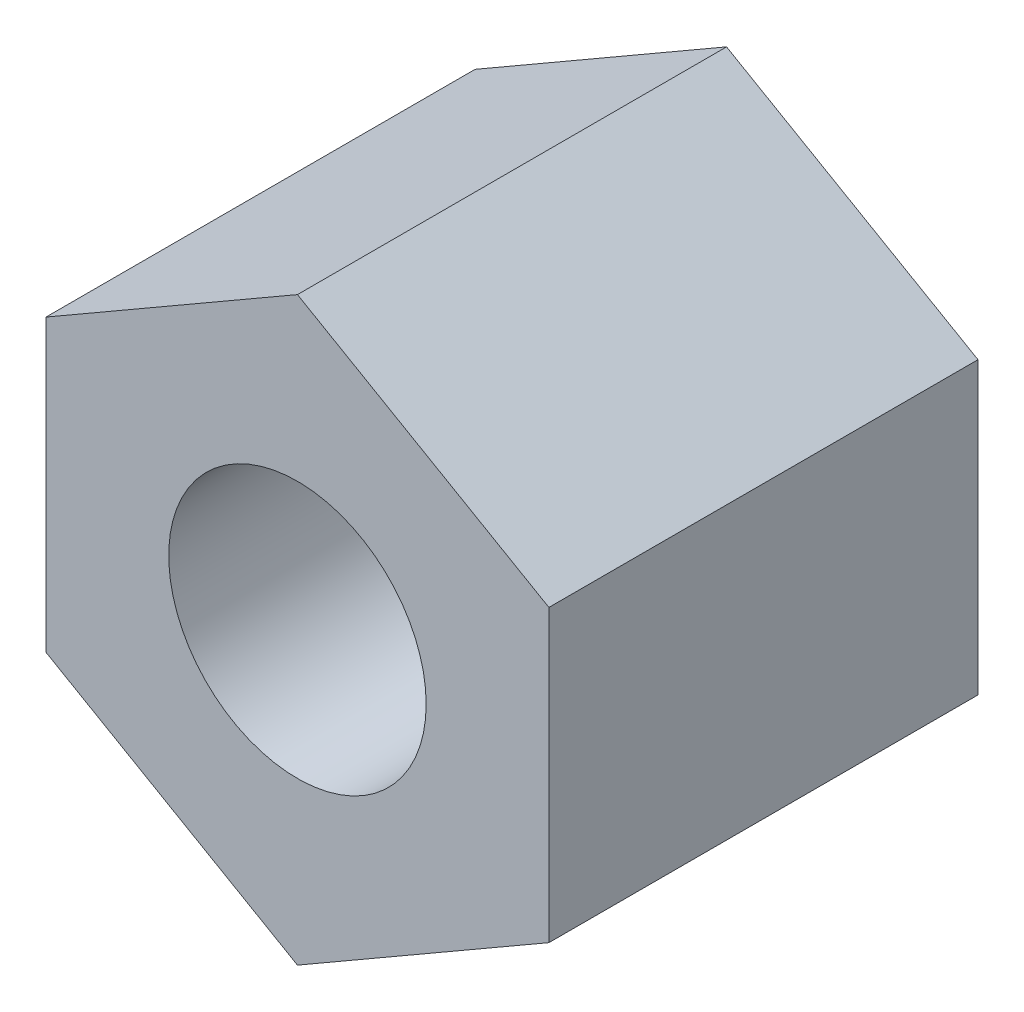
ISO-10303-21;
HEADER;
FILE_DESCRIPTION(('STEP AP214'),'2;1');
FILE_NAME('part.step','',(''),(''),'','','');
FILE_SCHEMA(('AUTOMOTIVE_DESIGN { 1 0 10303 214 1 1 1 1 }'));
ENDSEC;
DATA;
#1=APPLICATION_CONTEXT('core data for automotive mechanical design processes');
#2=APPLICATION_PROTOCOL_DEFINITION('international standard','automotive_design',2000,#1);
#3=PRODUCT_CONTEXT('',#1,'mechanical');
#4=PRODUCT('Part','Part','',(#3));
#5=PRODUCT_RELATED_PRODUCT_CATEGORY('part','',(#4));
#6=PRODUCT_DEFINITION_FORMATION('','',#4);
#7=PRODUCT_DEFINITION_CONTEXT('part definition',#1,'design');
#8=PRODUCT_DEFINITION('design','',#6,#7);
#9=PRODUCT_DEFINITION_SHAPE('','',#8);
#10=(LENGTH_UNIT() NAMED_UNIT(*) SI_UNIT(.MILLI.,.METRE.));
#11=(NAMED_UNIT(*) PLANE_ANGLE_UNIT() SI_UNIT($,.RADIAN.));
#12=(NAMED_UNIT(*) SI_UNIT($,.STERADIAN.) SOLID_ANGLE_UNIT());
#13=UNCERTAINTY_MEASURE_WITH_UNIT(LENGTH_MEASURE(1.E-05),#10,'distance_accuracy_value','');
#14=(GEOMETRIC_REPRESENTATION_CONTEXT(3) GLOBAL_UNCERTAINTY_ASSIGNED_CONTEXT((#13)) GLOBAL_UNIT_ASSIGNED_CONTEXT((#10,
#11,#12)) REPRESENTATION_CONTEXT('',''));
#15=CARTESIAN_POINT('',(0.,0.,0.));
#16=DIRECTION('',(0.,0.,1.));
#17=DIRECTION('',(1.,0.,0.));
#18=AXIS2_PLACEMENT_3D('',#15,#16,#17);
#19=CARTESIAN_POINT('',(0.,0.,5.));
#20=DIRECTION('',(0.,0.,1.));
#21=DIRECTION('',(1.,0.,0.));
#22=AXIS2_PLACEMENT_3D('',#19,#20,#21);
#23=PLANE('',#22);
#24=DIRECTION('',(0.866025403784439,-0.5,0.));
#25=VECTOR('',#24,1.);
#26=CARTESIAN_POINT('',(-2.93,-1.6916362887256,5.));
#27=LINE('',#26,#25);
#28=CARTESIAN_POINT('',(-2.93,-1.6916362887256,5.));
#29=VERTEX_POINT('',#28);
#30=CARTESIAN_POINT('',(0.,-3.38327257745121,5.));
#31=VERTEX_POINT('',#30);
#32=EDGE_CURVE('E129',#29,#31,#27,.T.);
#33=ORIENTED_EDGE('',*,*,#32,.T.);
#34=DIRECTION('',(0.866025403784439,0.5,0.));
#35=VECTOR('',#34,1.);
#36=CARTESIAN_POINT('',(0.,-3.38327257745121,5.));
#37=LINE('',#36,#35);
#38=CARTESIAN_POINT('',(2.93,-1.6916362887256,5.));
#39=VERTEX_POINT('',#38);
#40=EDGE_CURVE('E87',#31,#39,#37,.T.);
#41=ORIENTED_EDGE('',*,*,#40,.T.);
#42=DIRECTION('',(0.,1.,0.));
#43=VECTOR('',#42,1.);
#44=CARTESIAN_POINT('',(2.93,-1.6916362887256,5.));
#45=LINE('',#44,#43);
#46=CARTESIAN_POINT('',(2.93,1.69163628872561,5.));
#47=VERTEX_POINT('',#46);
#48=EDGE_CURVE('E100',#39,#47,#45,.T.);
#49=ORIENTED_EDGE('',*,*,#48,.T.);
#50=DIRECTION('',(-0.866025403784439,0.5,0.));
#51=VECTOR('',#50,1.);
#52=CARTESIAN_POINT('',(2.93,1.69163628872561,5.));
#53=LINE('',#52,#51);
#54=CARTESIAN_POINT('',(0.,3.38327257745121,5.));
#55=VERTEX_POINT('',#54);
#56=EDGE_CURVE('E94',#47,#55,#53,.T.);
#57=ORIENTED_EDGE('',*,*,#56,.T.);
#58=DIRECTION('',(-0.866025403784439,-0.5,0.));
#59=VECTOR('',#58,1.);
#60=CARTESIAN_POINT('',(0.,3.38327257745121,5.));
#61=LINE('',#60,#59);
#62=CARTESIAN_POINT('',(-2.93,1.6916362887256,5.));
#63=VERTEX_POINT('',#62);
#64=EDGE_CURVE('E98',#55,#63,#61,.T.);
#65=ORIENTED_EDGE('',*,*,#64,.T.);
#66=DIRECTION('',(0.,-1.,0.));
#67=VECTOR('',#66,1.);
#68=CARTESIAN_POINT('',(-2.93,1.6916362887256,5.));
#69=LINE('',#68,#67);
#70=EDGE_CURVE('E50',#63,#29,#69,.T.);
#71=ORIENTED_EDGE('',*,*,#70,.T.);
#72=EDGE_LOOP('',(#33,#41,#49,#57,#65,#71));
#73=FACE_BOUND('',#72,.T.);
#74=CARTESIAN_POINT('',(0.,0.,5.));
#75=DIRECTION('',(0.,0.,1.));
#76=DIRECTION('',(1.,0.,0.));
#77=AXIS2_PLACEMENT_3D('',#74,#75,#76);
#78=CIRCLE('',#77,1.5);
#79=CARTESIAN_POINT('',(1.5,0.,5.));
#80=VERTEX_POINT('',#79);
#81=EDGE_CURVE('E122',#80,#80,#78,.T.);
#82=ORIENTED_EDGE('',*,*,#81,.F.);
#83=EDGE_LOOP('',(#82));
#84=FACE_BOUND('',#83,.T.);
#85=ADVANCED_FACE('F33',(#73,#84),#23,.T.);
#86=CARTESIAN_POINT('',(0.,0.,0.));
#87=DIRECTION('',(0.,0.,1.));
#88=DIRECTION('',(1.,0.,0.));
#89=AXIS2_PLACEMENT_3D('',#86,#87,#88);
#90=PLANE('',#89);
#91=DIRECTION('',(0.866025403784439,-0.5,0.));
#92=VECTOR('',#91,1.);
#93=CARTESIAN_POINT('',(-2.93,-1.6916362887256,0.));
#94=LINE('',#93,#92);
#95=CARTESIAN_POINT('',(-2.93,-1.6916362887256,0.));
#96=VERTEX_POINT('',#95);
#97=CARTESIAN_POINT('',(0.,-3.38327257745121,0.));
#98=VERTEX_POINT('',#97);
#99=EDGE_CURVE('E118',#96,#98,#94,.T.);
#100=ORIENTED_EDGE('',*,*,#99,.F.);
#101=DIRECTION('',(0.,-1.,0.));
#102=VECTOR('',#101,1.);
#103=CARTESIAN_POINT('',(-2.93,1.6916362887256,0.));
#104=LINE('',#103,#102);
#105=CARTESIAN_POINT('',(-2.93,1.6916362887256,0.));
#106=VERTEX_POINT('',#105);
#107=EDGE_CURVE('E79',#106,#96,#104,.T.);
#108=ORIENTED_EDGE('',*,*,#107,.F.);
#109=DIRECTION('',(-0.866025403784439,-0.5,0.));
#110=VECTOR('',#109,1.);
#111=CARTESIAN_POINT('',(0.,3.38327257745121,0.));
#112=LINE('',#111,#110);
#113=CARTESIAN_POINT('',(0.,3.38327257745121,0.));
#114=VERTEX_POINT('',#113);
#115=EDGE_CURVE('E73',#114,#106,#112,.T.);
#116=ORIENTED_EDGE('',*,*,#115,.F.);
#117=DIRECTION('',(-0.866025403784439,0.5,0.));
#118=VECTOR('',#117,1.);
#119=CARTESIAN_POINT('',(2.93,1.69163628872561,0.));
#120=LINE('',#119,#118);
#121=CARTESIAN_POINT('',(2.93,1.69163628872561,0.));
#122=VERTEX_POINT('',#121);
#123=EDGE_CURVE('E108',#122,#114,#120,.T.);
#124=ORIENTED_EDGE('',*,*,#123,.F.);
#125=DIRECTION('',(0.,1.,0.));
#126=VECTOR('',#125,1.);
#127=CARTESIAN_POINT('',(2.93,-1.6916362887256,0.));
#128=LINE('',#127,#126);
#129=CARTESIAN_POINT('',(2.93,-1.6916362887256,0.));
#130=VERTEX_POINT('',#129);
#131=EDGE_CURVE('E124',#130,#122,#128,.T.);
#132=ORIENTED_EDGE('',*,*,#131,.F.);
#133=DIRECTION('',(0.866025403784439,0.5,0.));
#134=VECTOR('',#133,1.);
#135=CARTESIAN_POINT('',(0.,-3.38327257745121,0.));
#136=LINE('',#135,#134);
#137=EDGE_CURVE('E121',#98,#130,#136,.T.);
#138=ORIENTED_EDGE('',*,*,#137,.F.);
#139=EDGE_LOOP('',(#100,#108,#116,#124,#132,#138));
#140=FACE_BOUND('',#139,.T.);
#141=CARTESIAN_POINT('',(0.,0.,0.));
#142=DIRECTION('',(0.,0.,1.));
#143=DIRECTION('',(1.,0.,0.));
#144=AXIS2_PLACEMENT_3D('',#141,#142,#143);
#145=CIRCLE('',#144,1.5);
#146=CARTESIAN_POINT('',(1.5,0.,0.));
#147=VERTEX_POINT('',#146);
#148=EDGE_CURVE('E222',#147,#147,#145,.T.);
#149=ORIENTED_EDGE('',*,*,#148,.T.);
#150=EDGE_LOOP('',(#149));
#151=FACE_BOUND('',#150,.T.);
#152=ADVANCED_FACE('F138',(#140,#151),#90,.F.);
#153=CARTESIAN_POINT('',(-2.93,-1.6916362887256,5.));
#154=DIRECTION('',(0.5,0.866025403784438,0.));
#155=DIRECTION('',(-0.866025403784439,0.5,0.));
#156=AXIS2_PLACEMENT_3D('',#153,#154,#155);
#157=PLANE('',#156);
#158=ORIENTED_EDGE('',*,*,#99,.T.);
#159=DIRECTION('',(0.,0.,-1.));
#160=VECTOR('',#159,1.);
#161=CARTESIAN_POINT('',(0.,-3.38327257745121,5.));
#162=LINE('',#161,#160);
#163=EDGE_CURVE('E11',#31,#98,#162,.T.);
#164=ORIENTED_EDGE('',*,*,#163,.F.);
#165=ORIENTED_EDGE('',*,*,#32,.F.);
#166=DIRECTION('',(0.,0.,-1.));
#167=VECTOR('',#166,1.);
#168=CARTESIAN_POINT('',(-2.93,-1.6916362887256,5.));
#169=LINE('',#168,#167);
#170=EDGE_CURVE('E114',#29,#96,#169,.T.);
#171=ORIENTED_EDGE('',*,*,#170,.T.);
#172=EDGE_LOOP('',(#158,#164,#165,#171));
#173=FACE_BOUND('',#172,.T.);
#174=ADVANCED_FACE('F35',(#173),#157,.F.);
#175=CARTESIAN_POINT('',(0.,-3.38327257745121,5.));
#176=DIRECTION('',(-0.5,0.866025403784438,0.));
#177=DIRECTION('',(-0.866025403784438,-0.5,0.));
#178=AXIS2_PLACEMENT_3D('',#175,#176,#177);
#179=PLANE('',#178);
#180=ORIENTED_EDGE('',*,*,#137,.T.);
#181=DIRECTION('',(0.,0.,-1.));
#182=VECTOR('',#181,1.);
#183=CARTESIAN_POINT('',(2.93,-1.6916362887256,5.));
#184=LINE('',#183,#182);
#185=EDGE_CURVE('E42',#39,#130,#184,.T.);
#186=ORIENTED_EDGE('',*,*,#185,.F.);
#187=ORIENTED_EDGE('',*,*,#40,.F.);
#188=ORIENTED_EDGE('',*,*,#163,.T.);
#189=EDGE_LOOP('',(#180,#186,#187,#188));
#190=FACE_BOUND('',#189,.T.);
#191=ADVANCED_FACE('F163',(#190),#179,.F.);
#192=CARTESIAN_POINT('',(2.93,-1.6916362887256,5.));
#193=DIRECTION('',(-1.,0.,0.));
#194=DIRECTION('',(0.,0.,1.));
#195=AXIS2_PLACEMENT_3D('',#192,#193,#194);
#196=PLANE('',#195);
#197=ORIENTED_EDGE('',*,*,#131,.T.);
#198=DIRECTION('',(0.,0.,-1.));
#199=VECTOR('',#198,1.);
#200=CARTESIAN_POINT('',(2.93,1.69163628872561,5.));
#201=LINE('',#200,#199);
#202=EDGE_CURVE('E109',#47,#122,#201,.T.);
#203=ORIENTED_EDGE('',*,*,#202,.F.);
#204=ORIENTED_EDGE('',*,*,#48,.F.);
#205=ORIENTED_EDGE('',*,*,#185,.T.);
#206=EDGE_LOOP('',(#197,#203,#204,#205));
#207=FACE_BOUND('',#206,.T.);
#208=ADVANCED_FACE('F135',(#207),#196,.F.);
#209=CARTESIAN_POINT('',(2.93,1.69163628872561,5.));
#210=DIRECTION('',(-0.5,-0.866025403784439,0.));
#211=DIRECTION('',(0.866025403784439,-0.5,0.));
#212=AXIS2_PLACEMENT_3D('',#209,#210,#211);
#213=PLANE('',#212);
#214=ORIENTED_EDGE('',*,*,#123,.T.);
#215=DIRECTION('',(0.,0.,-1.));
#216=VECTOR('',#215,1.);
#217=CARTESIAN_POINT('',(0.,3.38327257745121,5.));
#218=LINE('',#217,#216);
#219=EDGE_CURVE('E105',#55,#114,#218,.T.);
#220=ORIENTED_EDGE('',*,*,#219,.F.);
#221=ORIENTED_EDGE('',*,*,#56,.F.);
#222=ORIENTED_EDGE('',*,*,#202,.T.);
#223=EDGE_LOOP('',(#214,#220,#221,#222));
#224=FACE_BOUND('',#223,.T.);
#225=ADVANCED_FACE('F106',(#224),#213,.F.);
#226=CARTESIAN_POINT('',(0.,3.38327257745121,5.));
#227=DIRECTION('',(0.5,-0.866025403784439,0.));
#228=DIRECTION('',(0.866025403784439,0.5,0.));
#229=AXIS2_PLACEMENT_3D('',#226,#227,#228);
#230=PLANE('',#229);
#231=ORIENTED_EDGE('',*,*,#115,.T.);
#232=DIRECTION('',(0.,0.,-1.));
#233=VECTOR('',#232,1.);
#234=CARTESIAN_POINT('',(-2.93,1.6916362887256,5.));
#235=LINE('',#234,#233);
#236=EDGE_CURVE('E110',#63,#106,#235,.T.);
#237=ORIENTED_EDGE('',*,*,#236,.F.);
#238=ORIENTED_EDGE('',*,*,#64,.F.);
#239=ORIENTED_EDGE('',*,*,#219,.T.);
#240=EDGE_LOOP('',(#231,#237,#238,#239));
#241=FACE_BOUND('',#240,.T.);
#242=ADVANCED_FACE('F112',(#241),#230,.F.);
#243=CARTESIAN_POINT('',(-2.93,1.6916362887256,5.));
#244=DIRECTION('',(1.,0.,0.));
#245=DIRECTION('',(0.,0.,-1.));
#246=AXIS2_PLACEMENT_3D('',#243,#244,#245);
#247=PLANE('',#246);
#248=ORIENTED_EDGE('',*,*,#107,.T.);
#249=ORIENTED_EDGE('',*,*,#170,.F.);
#250=ORIENTED_EDGE('',*,*,#70,.F.);
#251=ORIENTED_EDGE('',*,*,#236,.T.);
#252=EDGE_LOOP('',(#248,#249,#250,#251));
#253=FACE_BOUND('',#252,.T.);
#254=ADVANCED_FACE('F143',(#253),#247,.F.);
#255=CARTESIAN_POINT('',(0.,0.,5.));
#256=DIRECTION('',(0.,0.,-1.));
#257=DIRECTION('',(-1.,0.,0.));
#258=AXIS2_PLACEMENT_3D('',#255,#256,#257);
#259=CYLINDRICAL_SURFACE('',#258,1.5);
#260=ORIENTED_EDGE('',*,*,#81,.T.);
#261=EDGE_LOOP('',(#260));
#262=FACE_BOUND('',#261,.T.);
#263=ORIENTED_EDGE('',*,*,#148,.F.);
#264=EDGE_LOOP('',(#263));
#265=FACE_BOUND('',#264,.T.);
#266=ADVANCED_FACE('F145',(#262,#265),#259,.F.);
#267=CLOSED_SHELL('',(#85,#152,#174,#191,#208,#225,#242,#254,#266));
#268=MANIFOLD_SOLID_BREP('B2',#267);
#269=ADVANCED_BREP_SHAPE_REPRESENTATION('',(#18,#268),#14);
#270=SHAPE_DEFINITION_REPRESENTATION(#9,#269);
ENDSEC;
END-ISO-10303-21;
